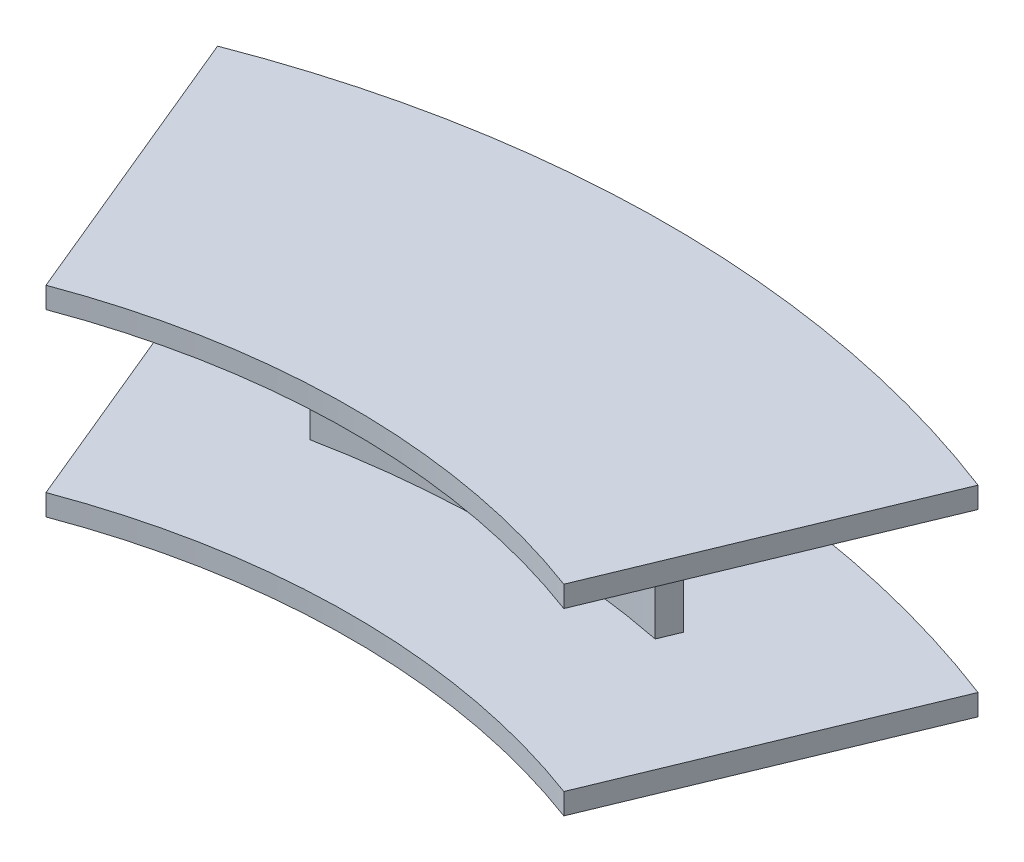
ISO-10303-21;
HEADER;
FILE_DESCRIPTION(('STEP AP214'),'2;1');
FILE_NAME('part.step','',(''),(''),'','','');
FILE_SCHEMA(('AUTOMOTIVE_DESIGN { 1 0 10303 214 1 1 1 1 }'));
ENDSEC;
DATA;
#1=APPLICATION_CONTEXT('core data for automotive mechanical design processes');
#2=APPLICATION_PROTOCOL_DEFINITION('international standard','automotive_design',2000,#1);
#3=PRODUCT_CONTEXT('',#1,'mechanical');
#4=PRODUCT('Part','Part','',(#3));
#5=PRODUCT_RELATED_PRODUCT_CATEGORY('part','',(#4));
#6=PRODUCT_DEFINITION_FORMATION('','',#4);
#7=PRODUCT_DEFINITION_CONTEXT('part definition',#1,'design');
#8=PRODUCT_DEFINITION('design','',#6,#7);
#9=PRODUCT_DEFINITION_SHAPE('','',#8);
#10=(LENGTH_UNIT() NAMED_UNIT(*) SI_UNIT(.MILLI.,.METRE.));
#11=(NAMED_UNIT(*) PLANE_ANGLE_UNIT() SI_UNIT($,.RADIAN.));
#12=(NAMED_UNIT(*) SI_UNIT($,.STERADIAN.) SOLID_ANGLE_UNIT());
#13=UNCERTAINTY_MEASURE_WITH_UNIT(LENGTH_MEASURE(1.E-05),#10,'distance_accuracy_value','');
#14=(GEOMETRIC_REPRESENTATION_CONTEXT(3) GLOBAL_UNCERTAINTY_ASSIGNED_CONTEXT((#13)) GLOBAL_UNIT_ASSIGNED_CONTEXT((#10,
#11,#12)) REPRESENTATION_CONTEXT('',''));
#15=CARTESIAN_POINT('',(0.,0.,0.));
#16=DIRECTION('',(0.,0.,1.));
#17=DIRECTION('',(1.,0.,0.));
#18=AXIS2_PLACEMENT_3D('',#15,#16,#17);
#19=CARTESIAN_POINT('',(-0.222015842665929,5.,413.473523483309));
#20=DIRECTION('',(0.,1.,0.));
#21=DIRECTION('',(0.,0.,1.));
#22=AXIS2_PLACEMENT_3D('',#19,#20,#21);
#23=PLANE('',#22);
#24=CARTESIAN_POINT('',(-0.222015842665929,5.,413.473523483309));
#25=DIRECTION('',(0.,1.,0.));
#26=DIRECTION('',(0.,0.,1.));
#27=AXIS2_PLACEMENT_3D('',#24,#25,#26);
#28=CIRCLE('',#27,500.);
#29=CARTESIAN_POINT('',(179.777984157334,5.,-53.0026281043152));
#30=VERTEX_POINT('',#29);
#31=CARTESIAN_POINT('',(-180.222015842666,5.,-53.0026281043152));
#32=VERTEX_POINT('',#31);
#33=EDGE_CURVE('E204',#30,#32,#28,.T.);
#34=ORIENTED_EDGE('',*,*,#33,.T.);
#35=DIRECTION('',(0.382683432365087,0.,0.923879532511288));
#36=VECTOR('',#35,1.);
#37=CARTESIAN_POINT('',(-180.222015842666,5.,-53.0026281043152));
#38=LINE('',#37,#36);
#39=CARTESIAN_POINT('',(-122.795016255247,5.,85.6384131460275));
#40=VERTEX_POINT('',#39);
#41=EDGE_CURVE('E85',#32,#40,#38,.T.);
#42=ORIENTED_EDGE('',*,*,#41,.T.);
#43=CARTESIAN_POINT('',(-0.222015842665929,5.,413.473523483309));
#44=DIRECTION('',(0.,-1.,0.));
#45=DIRECTION('',(0.,0.,-1.));
#46=AXIS2_PLACEMENT_3D('',#43,#44,#45);
#47=CIRCLE('',#46,350.);
#48=CARTESIAN_POINT('',(122.350984569915,5.,85.6384131460275));
#49=VERTEX_POINT('',#48);
#50=EDGE_CURVE('E207',#40,#49,#47,.T.);
#51=ORIENTED_EDGE('',*,*,#50,.T.);
#52=DIRECTION('',(0.382683432365087,0.,-0.923879532511288));
#53=VECTOR('',#52,1.);
#54=CARTESIAN_POINT('',(122.350984569915,5.,85.6384131460275));
#55=LINE('',#54,#53);
#56=EDGE_CURVE('E57',#49,#30,#55,.T.);
#57=ORIENTED_EDGE('',*,*,#56,.T.);
#58=EDGE_LOOP('',(#34,#42,#51,#57));
#59=FACE_BOUND('',#58,.T.);
#60=DIRECTION('',(0.382683432365086,0.,0.923879532511288));
#61=VECTOR('',#60,1.);
#62=CARTESIAN_POINT('',(-85.7839924428969,5.,-7.92788629157737));
#63=LINE('',#62,#61);
#64=CARTESIAN_POINT('',(-85.7839924428969,5.,-7.92788629157737));
#65=VERTEX_POINT('',#64);
#66=CARTESIAN_POINT('',(-81.8834704751287,5.,1.48880674334256));
#67=VERTEX_POINT('',#66);
#68=EDGE_CURVE('E190',#65,#67,#63,.T.);
#69=ORIENTED_EDGE('',*,*,#68,.F.);
#70=CARTESIAN_POINT('',(-0.222015842665929,5.,413.473523483309));
#71=DIRECTION('',(0.,1.,0.));
#72=DIRECTION('',(0.,0.,1.));
#73=AXIS2_PLACEMENT_3D('',#70,#71,#72);
#74=CIRCLE('',#73,430.);
#75=CARTESIAN_POINT('',(85.3399607575651,5.,-7.92788629157731));
#76=VERTEX_POINT('',#75);
#77=EDGE_CURVE('E142',#76,#65,#74,.T.);
#78=ORIENTED_EDGE('',*,*,#77,.F.);
#79=DIRECTION('',(0.382683432365086,0.,-0.923879532511288));
#80=VECTOR('',#79,1.);
#81=CARTESIAN_POINT('',(81.4394387897971,5.,1.48880674334262));
#82=LINE('',#81,#80);
#83=CARTESIAN_POINT('',(81.4394387897971,5.,1.48880674334256));
#84=VERTEX_POINT('',#83);
#85=EDGE_CURVE('E178',#84,#76,#82,.T.);
#86=ORIENTED_EDGE('',*,*,#85,.F.);
#87=CARTESIAN_POINT('',(-0.222015842665929,5.,413.473523483309));
#88=DIRECTION('',(0.,-1.,0.));
#89=DIRECTION('',(0.,0.,1.));
#90=AXIS2_PLACEMENT_3D('',#87,#88,#89);
#91=CIRCLE('',#90,420.);
#92=EDGE_CURVE('E192',#67,#84,#91,.T.);
#93=ORIENTED_EDGE('',*,*,#92,.F.);
#94=EDGE_LOOP('',(#69,#78,#86,#93));
#95=FACE_BOUND('',#94,.T.);
#96=ADVANCED_FACE('F33',(#59,#95),#23,.T.);
#97=CARTESIAN_POINT('',(-0.222015842665929,5.,413.473523483309));
#98=DIRECTION('',(0.,-1.,0.));
#99=DIRECTION('',(0.,0.,-1.));
#100=AXIS2_PLACEMENT_3D('',#97,#98,#99);
#101=CYLINDRICAL_SURFACE('',#100,500.);
#102=CARTESIAN_POINT('',(-0.222015842665929,-5.,413.473523483309));
#103=DIRECTION('',(0.,1.,0.));
#104=DIRECTION('',(0.,0.,1.));
#105=AXIS2_PLACEMENT_3D('',#102,#103,#104);
#106=CIRCLE('',#105,500.);
#107=CARTESIAN_POINT('',(179.777984157334,-5.,-53.0026281043152));
#108=VERTEX_POINT('',#107);
#109=CARTESIAN_POINT('',(-180.222015842666,-5.,-53.0026281043152));
#110=VERTEX_POINT('',#109);
#111=EDGE_CURVE('E203',#108,#110,#106,.T.);
#112=ORIENTED_EDGE('',*,*,#111,.T.);
#113=DIRECTION('',(0.,-1.,0.));
#114=VECTOR('',#113,1.);
#115=CARTESIAN_POINT('',(-180.222015842666,5.,-53.0026281043152));
#116=LINE('',#115,#114);
#117=EDGE_CURVE('E11',#32,#110,#116,.T.);
#118=ORIENTED_EDGE('',*,*,#117,.F.);
#119=ORIENTED_EDGE('',*,*,#33,.F.);
#120=DIRECTION('',(0.,-1.,0.));
#121=VECTOR('',#120,1.);
#122=CARTESIAN_POINT('',(179.777984157334,5.,-53.0026281043152));
#123=LINE('',#122,#121);
#124=EDGE_CURVE('E210',#30,#108,#123,.T.);
#125=ORIENTED_EDGE('',*,*,#124,.T.);
#126=EDGE_LOOP('',(#112,#118,#119,#125));
#127=FACE_BOUND('',#126,.T.);
#128=ADVANCED_FACE('F35',(#127),#101,.T.);
#129=CARTESIAN_POINT('',(-180.222015842666,5.,-53.0026281043152));
#130=DIRECTION('',(0.923879532511288,0.,-0.382683432365087));
#131=DIRECTION('',(-0.382683432365087,0.,-0.923879532511288));
#132=AXIS2_PLACEMENT_3D('',#129,#130,#131);
#133=PLANE('',#132);
#134=DIRECTION('',(0.382683432365087,0.,0.923879532511288));
#135=VECTOR('',#134,1.);
#136=CARTESIAN_POINT('',(-180.222015842666,-5.,-53.0026281043152));
#137=LINE('',#136,#135);
#138=CARTESIAN_POINT('',(-122.795016255247,-5.,85.6384131460275));
#139=VERTEX_POINT('',#138);
#140=EDGE_CURVE('E213',#110,#139,#137,.T.);
#141=ORIENTED_EDGE('',*,*,#140,.T.);
#142=DIRECTION('',(0.,-1.,0.));
#143=VECTOR('',#142,1.);
#144=CARTESIAN_POINT('',(-122.795016255247,5.,85.6384131460275));
#145=LINE('',#144,#143);
#146=EDGE_CURVE('E41',#40,#139,#145,.T.);
#147=ORIENTED_EDGE('',*,*,#146,.F.);
#148=ORIENTED_EDGE('',*,*,#41,.F.);
#149=ORIENTED_EDGE('',*,*,#117,.T.);
#150=EDGE_LOOP('',(#141,#147,#148,#149));
#151=FACE_BOUND('',#150,.T.);
#152=ADVANCED_FACE('F241',(#151),#133,.F.);
#153=CARTESIAN_POINT('',(-0.222015842665929,5.,413.473523483309));
#154=DIRECTION('',(0.,-1.,0.));
#155=DIRECTION('',(0.,0.,-1.));
#156=AXIS2_PLACEMENT_3D('',#153,#154,#155);
#157=CYLINDRICAL_SURFACE('',#156,350.);
#158=CARTESIAN_POINT('',(-0.222015842665929,-5.,413.473523483309));
#159=DIRECTION('',(0.,-1.,0.));
#160=DIRECTION('',(0.,0.,-1.));
#161=AXIS2_PLACEMENT_3D('',#158,#159,#160);
#162=CIRCLE('',#161,350.);
#163=CARTESIAN_POINT('',(122.350984569915,-5.,85.6384131460275));
#164=VERTEX_POINT('',#163);
#165=EDGE_CURVE('E215',#139,#164,#162,.T.);
#166=ORIENTED_EDGE('',*,*,#165,.T.);
#167=DIRECTION('',(0.,-1.,0.));
#168=VECTOR('',#167,1.);
#169=CARTESIAN_POINT('',(122.350984569915,5.,85.6384131460275));
#170=LINE('',#169,#168);
#171=EDGE_CURVE('E219',#49,#164,#170,.T.);
#172=ORIENTED_EDGE('',*,*,#171,.F.);
#173=ORIENTED_EDGE('',*,*,#50,.F.);
#174=ORIENTED_EDGE('',*,*,#146,.T.);
#175=EDGE_LOOP('',(#166,#172,#173,#174));
#176=FACE_BOUND('',#175,.T.);
#177=ADVANCED_FACE('F224',(#176),#157,.F.);
#178=CARTESIAN_POINT('',(122.350984569915,5.,85.6384131460275));
#179=DIRECTION('',(-0.923879532511288,0.,-0.382683432365087));
#180=DIRECTION('',(-0.382683432365087,0.,0.923879532511288));
#181=AXIS2_PLACEMENT_3D('',#178,#179,#180);
#182=PLANE('',#181);
#183=DIRECTION('',(0.382683432365087,0.,-0.923879532511288));
#184=VECTOR('',#183,1.);
#185=CARTESIAN_POINT('',(122.350984569915,-5.,85.6384131460275));
#186=LINE('',#185,#184);
#187=EDGE_CURVE('E78',#164,#108,#186,.T.);
#188=ORIENTED_EDGE('',*,*,#187,.T.);
#189=ORIENTED_EDGE('',*,*,#124,.F.);
#190=ORIENTED_EDGE('',*,*,#56,.F.);
#191=ORIENTED_EDGE('',*,*,#171,.T.);
#192=EDGE_LOOP('',(#188,#189,#190,#191));
#193=FACE_BOUND('',#192,.T.);
#194=ADVANCED_FACE('F232',(#193),#182,.F.);
#195=CARTESIAN_POINT('',(-0.222015842665929,-5.,413.473523483309));
#196=DIRECTION('',(0.,1.,0.));
#197=DIRECTION('',(0.,0.,1.));
#198=AXIS2_PLACEMENT_3D('',#195,#196,#197);
#199=PLANE('',#198);
#200=ORIENTED_EDGE('',*,*,#111,.F.);
#201=ORIENTED_EDGE('',*,*,#187,.F.);
#202=ORIENTED_EDGE('',*,*,#165,.F.);
#203=ORIENTED_EDGE('',*,*,#140,.F.);
#204=EDGE_LOOP('',(#200,#201,#202,#203));
#205=FACE_BOUND('',#204,.T.);
#206=ADVANCED_FACE('F228',(#205),#199,.F.);
#207=CARTESIAN_POINT('',(-0.222015842665929,80.,413.473523483309));
#208=DIRECTION('',(0.,-1.,0.));
#209=DIRECTION('',(0.,0.,-1.));
#210=AXIS2_PLACEMENT_3D('',#207,#208,#209);
#211=CYLINDRICAL_SURFACE('',#210,430.);
#212=ORIENTED_EDGE('',*,*,#77,.T.);
#213=DIRECTION('',(0.,-1.,0.));
#214=VECTOR('',#213,1.);
#215=CARTESIAN_POINT('',(-85.7839924428969,80.,-7.92788629157737));
#216=LINE('',#215,#214);
#217=CARTESIAN_POINT('',(-85.7839924428969,80.,-7.92788629157737));
#218=VERTEX_POINT('',#217);
#219=EDGE_CURVE('E201',#218,#65,#216,.T.);
#220=ORIENTED_EDGE('',*,*,#219,.F.);
#221=CARTESIAN_POINT('',(-0.222015842665929,80.,413.473523483309));
#222=DIRECTION('',(0.,1.,0.));
#223=DIRECTION('',(0.,0.,1.));
#224=AXIS2_PLACEMENT_3D('',#221,#222,#223);
#225=CIRCLE('',#224,430.);
#226=CARTESIAN_POINT('',(85.3399607575651,80.,-7.92788629157731));
#227=VERTEX_POINT('',#226);
#228=EDGE_CURVE('E174',#227,#218,#225,.T.);
#229=ORIENTED_EDGE('',*,*,#228,.F.);
#230=DIRECTION('',(0.,-1.,0.));
#231=VECTOR('',#230,1.);
#232=CARTESIAN_POINT('',(85.3399607575651,80.,-7.92788629157731));
#233=LINE('',#232,#231);
#234=EDGE_CURVE('E187',#227,#76,#233,.T.);
#235=ORIENTED_EDGE('',*,*,#234,.T.);
#236=EDGE_LOOP('',(#212,#220,#229,#235));
#237=FACE_BOUND('',#236,.T.);
#238=ADVANCED_FACE('F239',(#237),#211,.T.);
#239=CARTESIAN_POINT('',(-85.7839924428969,80.,-7.92788629157737));
#240=DIRECTION('',(0.923879532511288,0.,-0.382683432365086));
#241=DIRECTION('',(-0.382683432365086,0.,-0.923879532511288));
#242=AXIS2_PLACEMENT_3D('',#239,#240,#241);
#243=PLANE('',#242);
#244=ORIENTED_EDGE('',*,*,#68,.T.);
#245=DIRECTION('',(0.,-1.,0.));
#246=VECTOR('',#245,1.);
#247=CARTESIAN_POINT('',(-81.8834704751287,80.,1.48880674334256));
#248=LINE('',#247,#246);
#249=CARTESIAN_POINT('',(-81.8834704751287,80.,1.48880674334256));
#250=VERTEX_POINT('',#249);
#251=EDGE_CURVE('E198',#250,#67,#248,.T.);
#252=ORIENTED_EDGE('',*,*,#251,.F.);
#253=DIRECTION('',(0.382683432365086,0.,0.923879532511288));
#254=VECTOR('',#253,1.);
#255=CARTESIAN_POINT('',(-85.7839924428969,80.,-7.92788629157737));
#256=LINE('',#255,#254);
#257=EDGE_CURVE('E177',#218,#250,#256,.T.);
#258=ORIENTED_EDGE('',*,*,#257,.F.);
#259=ORIENTED_EDGE('',*,*,#219,.T.);
#260=EDGE_LOOP('',(#244,#252,#258,#259));
#261=FACE_BOUND('',#260,.T.);
#262=ADVANCED_FACE('F252',(#261),#243,.F.);
#263=CARTESIAN_POINT('',(-0.222015842665929,80.,413.473523483309));
#264=DIRECTION('',(0.,-1.,0.));
#265=DIRECTION('',(0.,0.,-1.));
#266=AXIS2_PLACEMENT_3D('',#263,#264,#265);
#267=CYLINDRICAL_SURFACE('',#266,420.);
#268=ORIENTED_EDGE('',*,*,#92,.T.);
#269=DIRECTION('',(0.,-1.,0.));
#270=VECTOR('',#269,1.);
#271=CARTESIAN_POINT('',(81.4394387897971,80.,1.48880674334262));
#272=LINE('',#271,#270);
#273=CARTESIAN_POINT('',(81.4394387897971,80.,1.48880674334262));
#274=VERTEX_POINT('',#273);
#275=EDGE_CURVE('E48',#274,#84,#272,.T.);
#276=ORIENTED_EDGE('',*,*,#275,.F.);
#277=CARTESIAN_POINT('',(-0.222015842665929,80.,413.473523483309));
#278=DIRECTION('',(0.,-1.,0.));
#279=DIRECTION('',(0.,0.,1.));
#280=AXIS2_PLACEMENT_3D('',#277,#278,#279);
#281=CIRCLE('',#280,420.);
#282=EDGE_CURVE('E181',#250,#274,#281,.T.);
#283=ORIENTED_EDGE('',*,*,#282,.F.);
#284=ORIENTED_EDGE('',*,*,#251,.T.);
#285=EDGE_LOOP('',(#268,#276,#283,#284));
#286=FACE_BOUND('',#285,.T.);
#287=ADVANCED_FACE('F256',(#286),#267,.F.);
#288=CARTESIAN_POINT('',(81.4394387897971,80.,1.48880674334262));
#289=DIRECTION('',(-0.923879532511288,0.,-0.382683432365086));
#290=DIRECTION('',(-0.382683432365086,0.,0.923879532511288));
#291=AXIS2_PLACEMENT_3D('',#288,#289,#290);
#292=PLANE('',#291);
#293=ORIENTED_EDGE('',*,*,#85,.T.);
#294=ORIENTED_EDGE('',*,*,#234,.F.);
#295=DIRECTION('',(0.382683432365086,0.,-0.923879532511288));
#296=VECTOR('',#295,1.);
#297=CARTESIAN_POINT('',(81.4394387897971,80.,1.48880674334262));
#298=LINE('',#297,#296);
#299=EDGE_CURVE('E184',#274,#227,#298,.T.);
#300=ORIENTED_EDGE('',*,*,#299,.F.);
#301=ORIENTED_EDGE('',*,*,#275,.T.);
#302=EDGE_LOOP('',(#293,#294,#300,#301));
#303=FACE_BOUND('',#302,.T.);
#304=ADVANCED_FACE('F260',(#303),#292,.F.);
#305=CARTESIAN_POINT('',(-0.222015842665929,80.,413.473523483309));
#306=DIRECTION('',(0.,1.,0.));
#307=DIRECTION('',(0.,0.,1.));
#308=AXIS2_PLACEMENT_3D('',#305,#306,#307);
#309=CYLINDRICAL_SURFACE('',#308,500.);
#310=CARTESIAN_POINT('',(-0.222015842665929,90.,413.473523483309));
#311=DIRECTION('',(0.,1.,0.));
#312=DIRECTION('',(0.,0.,1.));
#313=AXIS2_PLACEMENT_3D('',#310,#311,#312);
#314=CIRCLE('',#313,500.);
#315=CARTESIAN_POINT('',(179.777984157334,90.,-53.0026281043152));
#316=VERTEX_POINT('',#315);
#317=CARTESIAN_POINT('',(-180.222015842666,90.,-53.0026281043152));
#318=VERTEX_POINT('',#317);
#319=EDGE_CURVE('E137',#316,#318,#314,.T.);
#320=ORIENTED_EDGE('',*,*,#319,.F.);
#321=DIRECTION('',(0.,1.,0.));
#322=VECTOR('',#321,1.);
#323=CARTESIAN_POINT('',(179.777984157334,80.,-53.0026281043152));
#324=LINE('',#323,#322);
#325=CARTESIAN_POINT('',(179.777984157334,80.,-53.0026281043152));
#326=VERTEX_POINT('',#325);
#327=EDGE_CURVE('E131',#326,#316,#324,.T.);
#328=ORIENTED_EDGE('',*,*,#327,.F.);
#329=CARTESIAN_POINT('',(-0.222015842665929,80.,413.473523483309));
#330=DIRECTION('',(0.,1.,0.));
#331=DIRECTION('',(0.,0.,1.));
#332=AXIS2_PLACEMENT_3D('',#329,#330,#331);
#333=CIRCLE('',#332,500.);
#334=CARTESIAN_POINT('',(-180.222015842666,80.,-53.0026281043152));
#335=VERTEX_POINT('',#334);
#336=EDGE_CURVE('E134',#326,#335,#333,.T.);
#337=ORIENTED_EDGE('',*,*,#336,.T.);
#338=DIRECTION('',(0.,1.,0.));
#339=VECTOR('',#338,1.);
#340=CARTESIAN_POINT('',(-180.222015842666,80.,-53.0026281043152));
#341=LINE('',#340,#339);
#342=EDGE_CURVE('E161',#335,#318,#341,.T.);
#343=ORIENTED_EDGE('',*,*,#342,.T.);
#344=EDGE_LOOP('',(#320,#328,#337,#343));
#345=FACE_BOUND('',#344,.T.);
#346=ADVANCED_FACE('F133',(#345),#309,.T.);
#347=CARTESIAN_POINT('',(122.350984569915,80.,85.6384131460275));
#348=DIRECTION('',(0.923879532511288,0.,0.382683432365087));
#349=DIRECTION('',(0.382683432365087,0.,-0.923879532511288));
#350=AXIS2_PLACEMENT_3D('',#347,#348,#349);
#351=PLANE('',#350);
#352=DIRECTION('',(0.382683432365087,0.,-0.923879532511288));
#353=VECTOR('',#352,1.);
#354=CARTESIAN_POINT('',(122.350984569915,90.,85.6384131460275));
#355=LINE('',#354,#353);
#356=CARTESIAN_POINT('',(122.350984569915,90.,85.6384131460275));
#357=VERTEX_POINT('',#356);
#358=EDGE_CURVE('E163',#357,#316,#355,.T.);
#359=ORIENTED_EDGE('',*,*,#358,.F.);
#360=DIRECTION('',(0.,1.,0.));
#361=VECTOR('',#360,1.);
#362=CARTESIAN_POINT('',(122.350984569915,80.,85.6384131460275));
#363=LINE('',#362,#361);
#364=CARTESIAN_POINT('',(122.350984569915,80.,85.6384131460275));
#365=VERTEX_POINT('',#364);
#366=EDGE_CURVE('E143',#365,#357,#363,.T.);
#367=ORIENTED_EDGE('',*,*,#366,.F.);
#368=DIRECTION('',(0.382683432365087,0.,-0.923879532511288));
#369=VECTOR('',#368,1.);
#370=CARTESIAN_POINT('',(122.350984569915,80.,85.6384131460275));
#371=LINE('',#370,#369);
#372=EDGE_CURVE('E149',#365,#326,#371,.T.);
#373=ORIENTED_EDGE('',*,*,#372,.T.);
#374=ORIENTED_EDGE('',*,*,#327,.T.);
#375=EDGE_LOOP('',(#359,#367,#373,#374));
#376=FACE_BOUND('',#375,.T.);
#377=ADVANCED_FACE('F155',(#376),#351,.T.);
#378=CARTESIAN_POINT('',(-0.222015842665929,80.,413.473523483309));
#379=DIRECTION('',(0.,1.,0.));
#380=DIRECTION('',(0.,0.,1.));
#381=AXIS2_PLACEMENT_3D('',#378,#379,#380);
#382=CYLINDRICAL_SURFACE('',#381,350.);
#383=CARTESIAN_POINT('',(-0.222015842665929,90.,413.473523483309));
#384=DIRECTION('',(0.,-1.,0.));
#385=DIRECTION('',(0.,0.,-1.));
#386=AXIS2_PLACEMENT_3D('',#383,#384,#385);
#387=CIRCLE('',#386,350.);
#388=CARTESIAN_POINT('',(-122.795016255247,90.,85.6384131460275));
#389=VERTEX_POINT('',#388);
#390=EDGE_CURVE('E165',#389,#357,#387,.T.);
#391=ORIENTED_EDGE('',*,*,#390,.F.);
#392=DIRECTION('',(0.,1.,0.));
#393=VECTOR('',#392,1.);
#394=CARTESIAN_POINT('',(-122.795016255247,80.,85.6384131460275));
#395=LINE('',#394,#393);
#396=CARTESIAN_POINT('',(-122.795016255247,80.,85.6384131460275));
#397=VERTEX_POINT('',#396);
#398=EDGE_CURVE('E171',#397,#389,#395,.T.);
#399=ORIENTED_EDGE('',*,*,#398,.F.);
#400=CARTESIAN_POINT('',(-0.222015842665929,80.,413.473523483309));
#401=DIRECTION('',(0.,-1.,0.));
#402=DIRECTION('',(0.,0.,-1.));
#403=AXIS2_PLACEMENT_3D('',#400,#401,#402);
#404=CIRCLE('',#403,350.);
#405=EDGE_CURVE('E156',#397,#365,#404,.T.);
#406=ORIENTED_EDGE('',*,*,#405,.T.);
#407=ORIENTED_EDGE('',*,*,#366,.T.);
#408=EDGE_LOOP('',(#391,#399,#406,#407));
#409=FACE_BOUND('',#408,.T.);
#410=ADVANCED_FACE('F268',(#409),#382,.F.);
#411=CARTESIAN_POINT('',(-180.222015842666,80.,-53.0026281043152));
#412=DIRECTION('',(-0.923879532511288,0.,0.382683432365087));
#413=DIRECTION('',(0.382683432365087,0.,0.923879532511288));
#414=AXIS2_PLACEMENT_3D('',#411,#412,#413);
#415=PLANE('',#414);
#416=DIRECTION('',(0.382683432365087,0.,0.923879532511288));
#417=VECTOR('',#416,1.);
#418=CARTESIAN_POINT('',(-180.222015842666,90.,-53.0026281043152));
#419=LINE('',#418,#417);
#420=EDGE_CURVE('E153',#318,#389,#419,.T.);
#421=ORIENTED_EDGE('',*,*,#420,.F.);
#422=ORIENTED_EDGE('',*,*,#342,.F.);
#423=DIRECTION('',(0.382683432365087,0.,0.923879532511288));
#424=VECTOR('',#423,1.);
#425=CARTESIAN_POINT('',(-180.222015842666,80.,-53.0026281043152));
#426=LINE('',#425,#424);
#427=EDGE_CURVE('E152',#335,#397,#426,.T.);
#428=ORIENTED_EDGE('',*,*,#427,.T.);
#429=ORIENTED_EDGE('',*,*,#398,.T.);
#430=EDGE_LOOP('',(#421,#422,#428,#429));
#431=FACE_BOUND('',#430,.T.);
#432=ADVANCED_FACE('F271',(#431),#415,.T.);
#433=CARTESIAN_POINT('',(-0.222015842665929,80.,413.473523483309));
#434=DIRECTION('',(0.,-1.,0.));
#435=DIRECTION('',(0.,0.,1.));
#436=AXIS2_PLACEMENT_3D('',#433,#434,#435);
#437=PLANE('',#436);
#438=ORIENTED_EDGE('',*,*,#299,.T.);
#439=ORIENTED_EDGE('',*,*,#228,.T.);
#440=ORIENTED_EDGE('',*,*,#257,.T.);
#441=ORIENTED_EDGE('',*,*,#282,.T.);
#442=EDGE_LOOP('',(#438,#439,#440,#441));
#443=FACE_BOUND('',#442,.T.);
#444=ORIENTED_EDGE('',*,*,#336,.F.);
#445=ORIENTED_EDGE('',*,*,#372,.F.);
#446=ORIENTED_EDGE('',*,*,#405,.F.);
#447=ORIENTED_EDGE('',*,*,#427,.F.);
#448=EDGE_LOOP('',(#444,#445,#446,#447));
#449=FACE_BOUND('',#448,.T.);
#450=ADVANCED_FACE('F147',(#443,#449),#437,.T.);
#451=CARTESIAN_POINT('',(-0.222015842665929,90.,413.473523483309));
#452=DIRECTION('',(0.,-1.,0.));
#453=DIRECTION('',(0.,0.,1.));
#454=AXIS2_PLACEMENT_3D('',#451,#452,#453);
#455=PLANE('',#454);
#456=ORIENTED_EDGE('',*,*,#319,.T.);
#457=ORIENTED_EDGE('',*,*,#420,.T.);
#458=ORIENTED_EDGE('',*,*,#390,.T.);
#459=ORIENTED_EDGE('',*,*,#358,.T.);
#460=EDGE_LOOP('',(#456,#457,#458,#459));
#461=FACE_BOUND('',#460,.T.);
#462=ADVANCED_FACE('F276',(#461),#455,.F.);
#463=CLOSED_SHELL('',(#96,#128,#152,#177,#194,#206,#238,#262,#287,#304,#346,#377,#410,#432,#450,#462));
#464=MANIFOLD_SOLID_BREP('B2',#463);
#465=ADVANCED_BREP_SHAPE_REPRESENTATION('',(#18,#464),#14);
#466=SHAPE_DEFINITION_REPRESENTATION(#9,#465);
ENDSEC;
END-ISO-10303-21;
